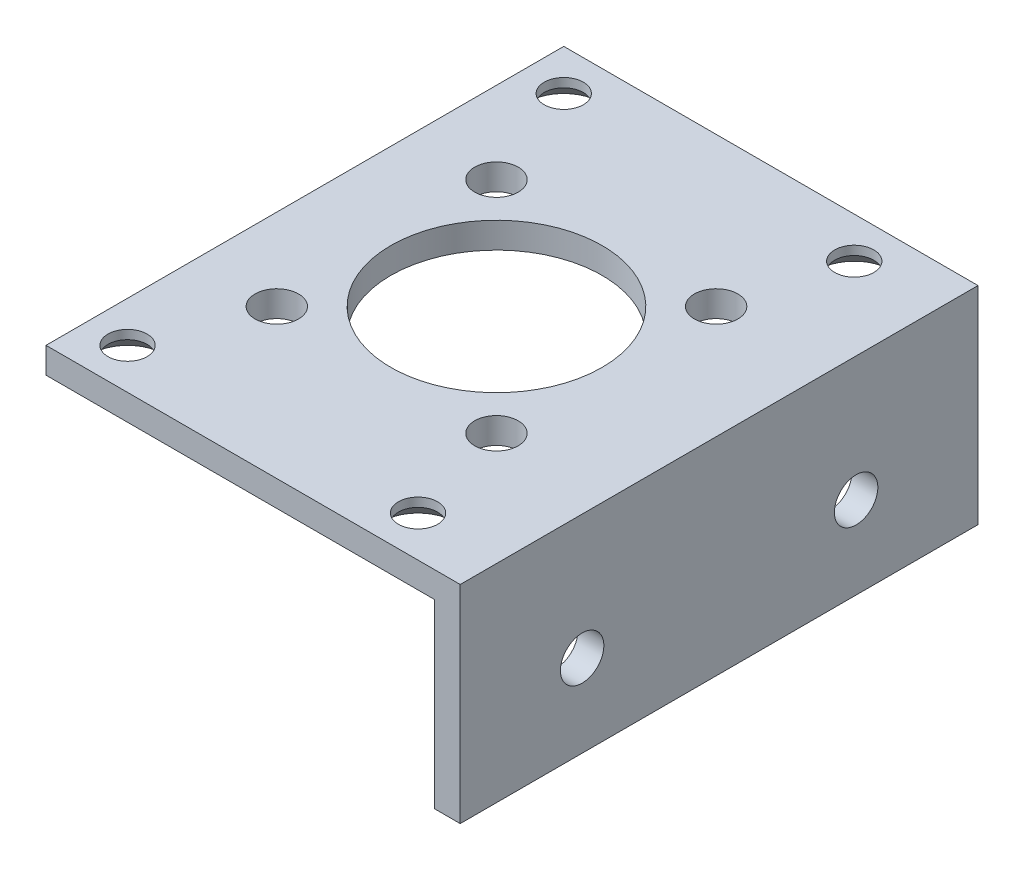
ISO-10303-21;
HEADER;
FILE_DESCRIPTION(('STEP AP214'),'2;1');
FILE_NAME('part.step','',(''),(''),'','','');
FILE_SCHEMA(('AUTOMOTIVE_DESIGN { 1 0 10303 214 1 1 1 1 }'));
ENDSEC;
DATA;
#1=APPLICATION_CONTEXT('core data for automotive mechanical design processes');
#2=APPLICATION_PROTOCOL_DEFINITION('international standard','automotive_design',2000,#1);
#3=PRODUCT_CONTEXT('',#1,'mechanical');
#4=PRODUCT('Part','Part','',(#3));
#5=PRODUCT_RELATED_PRODUCT_CATEGORY('part','',(#4));
#6=PRODUCT_DEFINITION_FORMATION('','',#4);
#7=PRODUCT_DEFINITION_CONTEXT('part definition',#1,'design');
#8=PRODUCT_DEFINITION('design','',#6,#7);
#9=PRODUCT_DEFINITION_SHAPE('','',#8);
#10=(LENGTH_UNIT() NAMED_UNIT(*) SI_UNIT(.MILLI.,.METRE.));
#11=(NAMED_UNIT(*) PLANE_ANGLE_UNIT() SI_UNIT($,.RADIAN.));
#12=(NAMED_UNIT(*) SI_UNIT($,.STERADIAN.) SOLID_ANGLE_UNIT());
#13=UNCERTAINTY_MEASURE_WITH_UNIT(LENGTH_MEASURE(1.E-05),#10,'distance_accuracy_value','');
#14=(GEOMETRIC_REPRESENTATION_CONTEXT(3) GLOBAL_UNCERTAINTY_ASSIGNED_CONTEXT((#13)) GLOBAL_UNIT_ASSIGNED_CONTEXT((#10,
#11,#12)) REPRESENTATION_CONTEXT('',''));
#15=CARTESIAN_POINT('',(0.,0.,0.));
#16=DIRECTION('',(0.,0.,1.));
#17=DIRECTION('',(1.,0.,0.));
#18=AXIS2_PLACEMENT_3D('',#15,#16,#17);
#19=CARTESIAN_POINT('',(-45.8,22.2250000001054,58.5));
#20=DIRECTION('',(0.,-1.,0.));
#21=DIRECTION('',(0.,0.,-1.));
#22=AXIS2_PLACEMENT_3D('',#19,#20,#21);
#23=CONICAL_SURFACE('',#22,4.47999999996319,0.785398163397448);
#24=CARTESIAN_POINT('',(-45.8,24.305,58.5));
#25=DIRECTION('',(0.,-1.,0.));
#26=DIRECTION('',(0.,0.,-1.));
#27=AXIS2_PLACEMENT_3D('',#24,#25,#26);
#28=CIRCLE('',#27,2.39999999999999);
#29=CARTESIAN_POINT('',(-45.8,24.305,56.1));
#30=VERTEX_POINT('',#29);
#31=EDGE_CURVE('E115',#30,#30,#28,.F.);
#32=ORIENTED_EDGE('',*,*,#31,.T.);
#33=EDGE_LOOP('',(#32));
#34=FACE_BOUND('',#33,.T.);
#35=CARTESIAN_POINT('',(-45.8,22.2249999999917,58.5));
#36=DIRECTION('',(0.,-1.,0.));
#37=DIRECTION('',(0.,0.,-1.));
#38=AXIS2_PLACEMENT_3D('',#35,#36,#37);
#39=CIRCLE('',#38,4.48000000007687);
#40=CARTESIAN_POINT('',(-45.8,22.2249999999917,54.0199999999231));
#41=VERTEX_POINT('',#40);
#42=EDGE_CURVE('E118',#41,#41,#39,.T.);
#43=ORIENTED_EDGE('',*,*,#42,.T.);
#44=EDGE_LOOP('',(#43));
#45=FACE_BOUND('',#44,.T.);
#46=ADVANCED_FACE('F17',(#34,#45),#23,.F.);
#47=CARTESIAN_POINT('',(-10.175,22.2249999999917,58.5));
#48=DIRECTION('',(0.,-1.,0.));
#49=DIRECTION('',(0.,0.,-1.));
#50=AXIS2_PLACEMENT_3D('',#47,#48,#49);
#51=CONICAL_SURFACE('',#50,4.48000000002003,0.785398163397448);
#52=CARTESIAN_POINT('',(-10.175,24.305,58.5));
#53=DIRECTION('',(0.,-1.,0.));
#54=DIRECTION('',(0.,0.,-1.));
#55=AXIS2_PLACEMENT_3D('',#52,#53,#54);
#56=CIRCLE('',#55,2.39999999999999);
#57=CARTESIAN_POINT('',(-10.175,24.305,56.1));
#58=VERTEX_POINT('',#57);
#59=EDGE_CURVE('E112',#58,#58,#56,.F.);
#60=ORIENTED_EDGE('',*,*,#59,.T.);
#61=EDGE_LOOP('',(#60));
#62=FACE_BOUND('',#61,.T.);
#63=CARTESIAN_POINT('',(-10.175,22.2249999999917,58.5));
#64=DIRECTION('',(0.,-1.,0.));
#65=DIRECTION('',(0.,0.,-1.));
#66=AXIS2_PLACEMENT_3D('',#63,#64,#65);
#67=CIRCLE('',#66,4.48000000002003);
#68=CARTESIAN_POINT('',(-10.175,22.2249999999917,54.01999999998));
#69=VERTEX_POINT('',#68);
#70=EDGE_CURVE('E103',#69,#69,#67,.T.);
#71=ORIENTED_EDGE('',*,*,#70,.T.);
#72=EDGE_LOOP('',(#71));
#73=FACE_BOUND('',#72,.T.);
#74=ADVANCED_FACE('F261',(#62,#73),#51,.F.);
#75=CARTESIAN_POINT('',(-10.175,22.2250000000486,5.));
#76=DIRECTION('',(0.,-1.,0.));
#77=DIRECTION('',(0.,0.,-1.));
#78=AXIS2_PLACEMENT_3D('',#75,#76,#77);
#79=CONICAL_SURFACE('',#78,4.47999999994863,0.785398163397448);
#80=CARTESIAN_POINT('',(-10.175,24.305,5.));
#81=DIRECTION('',(0.,-1.,0.));
#82=DIRECTION('',(0.,0.,-1.));
#83=AXIS2_PLACEMENT_3D('',#80,#81,#82);
#84=CIRCLE('',#83,2.39999999999999);
#85=CARTESIAN_POINT('',(-10.175,24.305,2.6));
#86=VERTEX_POINT('',#85);
#87=EDGE_CURVE('E109',#86,#86,#84,.F.);
#88=ORIENTED_EDGE('',*,*,#87,.T.);
#89=EDGE_LOOP('',(#88));
#90=FACE_BOUND('',#89,.T.);
#91=CARTESIAN_POINT('',(-10.175,22.2250000000486,5.));
#92=DIRECTION('',(0.,-1.,0.));
#93=DIRECTION('',(0.,0.,-1.));
#94=AXIS2_PLACEMENT_3D('',#91,#92,#93);
#95=CIRCLE('',#94,4.47999999994863);
#96=CARTESIAN_POINT('',(-10.175,22.2250000000486,0.520000000051368));
#97=VERTEX_POINT('',#96);
#98=EDGE_CURVE('E81',#97,#97,#95,.T.);
#99=ORIENTED_EDGE('',*,*,#98,.T.);
#100=EDGE_LOOP('',(#99));
#101=FACE_BOUND('',#100,.T.);
#102=ADVANCED_FACE('F266',(#90,#101),#79,.F.);
#103=CARTESIAN_POINT('',(-45.8,22.2250000001054,5.));
#104=DIRECTION('',(0.,-1.,0.));
#105=DIRECTION('',(0.,0.,-1.));
#106=AXIS2_PLACEMENT_3D('',#103,#104,#105);
#107=CONICAL_SURFACE('',#106,4.47999999994863,0.785398163397448);
#108=CARTESIAN_POINT('',(-45.8,24.305,5.));
#109=DIRECTION('',(0.,-1.,0.));
#110=DIRECTION('',(0.,0.,-1.));
#111=AXIS2_PLACEMENT_3D('',#108,#109,#110);
#112=CIRCLE('',#111,2.39999999999999);
#113=CARTESIAN_POINT('',(-45.8,24.305,2.6));
#114=VERTEX_POINT('',#113);
#115=EDGE_CURVE('E105',#114,#114,#112,.F.);
#116=ORIENTED_EDGE('',*,*,#115,.T.);
#117=EDGE_LOOP('',(#116));
#118=FACE_BOUND('',#117,.T.);
#119=CARTESIAN_POINT('',(-45.8,22.2250000000486,5.));
#120=DIRECTION('',(0.,-1.,0.));
#121=DIRECTION('',(0.,0.,-1.));
#122=AXIS2_PLACEMENT_3D('',#119,#120,#121);
#123=CIRCLE('',#122,4.48000000000547);
#124=CARTESIAN_POINT('',(-45.8,22.2250000000486,0.519999999994525));
#125=VERTEX_POINT('',#124);
#126=EDGE_CURVE('E82',#125,#125,#123,.T.);
#127=ORIENTED_EDGE('',*,*,#126,.T.);
#128=EDGE_LOOP('',(#127));
#129=FACE_BOUND('',#128,.T.);
#130=ADVANCED_FACE('F268',(#118,#129),#107,.F.);
#131=CARTESIAN_POINT('',(0.00100000000000013,10.1104945877069,48.55));
#132=DIRECTION('',(-1.,0.,0.));
#133=DIRECTION('',(0.,0.,1.));
#134=AXIS2_PLACEMENT_3D('',#131,#132,#133);
#135=CYLINDRICAL_SURFACE('',#134,2.665);
#136=CARTESIAN_POINT('',(-3.175,10.1104945877069,48.55));
#137=DIRECTION('',(-1.,0.,0.));
#138=DIRECTION('',(0.,0.,1.));
#139=AXIS2_PLACEMENT_3D('',#136,#137,#138);
#140=CIRCLE('',#139,2.665);
#141=CARTESIAN_POINT('',(-3.175,10.1104945877069,51.215));
#142=VERTEX_POINT('',#141);
#143=EDGE_CURVE('E20',#142,#142,#140,.T.);
#144=ORIENTED_EDGE('',*,*,#143,.T.);
#145=EDGE_LOOP('',(#144));
#146=FACE_BOUND('',#145,.T.);
#147=CARTESIAN_POINT('',(0.,10.1104945877069,48.55));
#148=DIRECTION('',(-1.,0.,0.));
#149=DIRECTION('',(0.,0.,1.));
#150=AXIS2_PLACEMENT_3D('',#147,#148,#149);
#151=CIRCLE('',#150,2.665);
#152=CARTESIAN_POINT('',(0.,10.1104945877069,51.215));
#153=VERTEX_POINT('',#152);
#154=EDGE_CURVE('E150',#153,#153,#151,.F.);
#155=ORIENTED_EDGE('',*,*,#154,.T.);
#156=EDGE_LOOP('',(#155));
#157=FACE_BOUND('',#156,.T.);
#158=ADVANCED_FACE('F180',(#146,#157),#135,.F.);
#159=CARTESIAN_POINT('',(0.00100000000000013,10.1104945877069,14.95));
#160=DIRECTION('',(-1.,0.,0.));
#161=DIRECTION('',(0.,0.,1.));
#162=AXIS2_PLACEMENT_3D('',#159,#160,#161);
#163=CYLINDRICAL_SURFACE('',#162,2.665);
#164=CARTESIAN_POINT('',(-3.175,10.1104945877069,14.95));
#165=DIRECTION('',(-1.,0.,0.));
#166=DIRECTION('',(0.,0.,1.));
#167=AXIS2_PLACEMENT_3D('',#164,#165,#166);
#168=CIRCLE('',#167,2.665);
#169=CARTESIAN_POINT('',(-3.175,10.1104945877069,17.615));
#170=VERTEX_POINT('',#169);
#171=EDGE_CURVE('E104',#170,#170,#168,.T.);
#172=ORIENTED_EDGE('',*,*,#171,.T.);
#173=EDGE_LOOP('',(#172));
#174=FACE_BOUND('',#173,.T.);
#175=CARTESIAN_POINT('',(0.,10.1104945877069,14.95));
#176=DIRECTION('',(-1.,0.,0.));
#177=DIRECTION('',(0.,0.,1.));
#178=AXIS2_PLACEMENT_3D('',#175,#176,#177);
#179=CIRCLE('',#178,2.665);
#180=CARTESIAN_POINT('',(0.,10.1104945877069,17.615));
#181=VERTEX_POINT('',#180);
#182=EDGE_CURVE('E98',#181,#181,#179,.F.);
#183=ORIENTED_EDGE('',*,*,#182,.T.);
#184=EDGE_LOOP('',(#183));
#185=FACE_BOUND('',#184,.T.);
#186=ADVANCED_FACE('F194',(#174,#185),#163,.F.);
#187=CARTESIAN_POINT('',(0.,0.,63.5));
#188=DIRECTION('',(0.,1.,0.));
#189=DIRECTION('',(-1.,0.,0.));
#190=AXIS2_PLACEMENT_3D('',#187,#188,#189);
#191=PLANE('',#190);
#192=DIRECTION('',(0.,0.,1.));
#193=VECTOR('',#192,1.);
#194=CARTESIAN_POINT('',(0.,0.,63.5));
#195=LINE('',#194,#193);
#196=CARTESIAN_POINT('',(0.,0.,0.));
#197=VERTEX_POINT('',#196);
#198=CARTESIAN_POINT('',(0.,0.,63.5));
#199=VERTEX_POINT('',#198);
#200=EDGE_CURVE('E96',#197,#199,#195,.T.);
#201=ORIENTED_EDGE('',*,*,#200,.T.);
#202=DIRECTION('',(-1.,0.,0.));
#203=VECTOR('',#202,1.);
#204=CARTESIAN_POINT('',(0.,0.,63.5));
#205=LINE('',#204,#203);
#206=CARTESIAN_POINT('',(-3.175,0.,63.5));
#207=VERTEX_POINT('',#206);
#208=EDGE_CURVE('E486',#199,#207,#205,.T.);
#209=ORIENTED_EDGE('',*,*,#208,.T.);
#210=DIRECTION('',(0.,0.,-1.));
#211=VECTOR('',#210,1.);
#212=CARTESIAN_POINT('',(-3.175,0.,63.5));
#213=LINE('',#212,#211);
#214=CARTESIAN_POINT('',(-3.175,0.,0.));
#215=VERTEX_POINT('',#214);
#216=EDGE_CURVE('E67',#207,#215,#213,.T.);
#217=ORIENTED_EDGE('',*,*,#216,.T.);
#218=DIRECTION('',(-1.,0.,0.));
#219=VECTOR('',#218,1.);
#220=CARTESIAN_POINT('',(0.,0.,0.));
#221=LINE('',#220,#219);
#222=EDGE_CURVE('E481',#197,#215,#221,.T.);
#223=ORIENTED_EDGE('',*,*,#222,.F.);
#224=EDGE_LOOP('',(#201,#209,#217,#223));
#225=FACE_BOUND('',#224,.T.);
#226=ADVANCED_FACE('F184',(#225),#191,.F.);
#227=CARTESIAN_POINT('',(-3.175,0.,63.5));
#228=DIRECTION('',(1.,0.,0.));
#229=DIRECTION('',(0.,0.,-1.));
#230=AXIS2_PLACEMENT_3D('',#227,#228,#229);
#231=PLANE('',#230);
#232=ORIENTED_EDGE('',*,*,#216,.F.);
#233=DIRECTION('',(0.,1.,0.));
#234=VECTOR('',#233,1.);
#235=CARTESIAN_POINT('',(-3.175,0.,63.5));
#236=LINE('',#235,#234);
#237=CARTESIAN_POINT('',(-3.175,22.225,63.5));
#238=VERTEX_POINT('',#237);
#239=EDGE_CURVE('E88',#207,#238,#236,.T.);
#240=ORIENTED_EDGE('',*,*,#239,.T.);
#241=DIRECTION('',(0.,0.,1.));
#242=VECTOR('',#241,1.);
#243=CARTESIAN_POINT('',(-3.175,22.225,63.5));
#244=LINE('',#243,#242);
#245=CARTESIAN_POINT('',(-3.175,22.225,0.));
#246=VERTEX_POINT('',#245);
#247=EDGE_CURVE('E73',#238,#246,#244,.F.);
#248=ORIENTED_EDGE('',*,*,#247,.T.);
#249=DIRECTION('',(0.,1.,0.));
#250=VECTOR('',#249,1.);
#251=CARTESIAN_POINT('',(-3.175,0.,0.));
#252=LINE('',#251,#250);
#253=EDGE_CURVE('E479',#215,#246,#252,.T.);
#254=ORIENTED_EDGE('',*,*,#253,.F.);
#255=EDGE_LOOP('',(#232,#240,#248,#254));
#256=FACE_BOUND('',#255,.T.);
#257=ORIENTED_EDGE('',*,*,#171,.F.);
#258=EDGE_LOOP('',(#257));
#259=FACE_BOUND('',#258,.T.);
#260=ORIENTED_EDGE('',*,*,#143,.F.);
#261=EDGE_LOOP('',(#260));
#262=FACE_BOUND('',#261,.T.);
#263=ADVANCED_FACE('F94',(#256,#259,#262),#231,.F.);
#264=CARTESIAN_POINT('',(-3.175,22.225,63.5));
#265=DIRECTION('',(0.,1.,0.));
#266=DIRECTION('',(-1.,0.,0.));
#267=AXIS2_PLACEMENT_3D('',#264,#265,#266);
#268=PLANE('',#267);
#269=ORIENTED_EDGE('',*,*,#42,.F.);
#270=EDGE_LOOP('',(#269));
#271=FACE_BOUND('',#270,.T.);
#272=ORIENTED_EDGE('',*,*,#98,.F.);
#273=EDGE_LOOP('',(#272));
#274=FACE_BOUND('',#273,.T.);
#275=ORIENTED_EDGE('',*,*,#247,.F.);
#276=DIRECTION('',(-1.,0.,0.));
#277=VECTOR('',#276,1.);
#278=CARTESIAN_POINT('',(0.,22.225,63.5));
#279=LINE('',#278,#277);
#280=CARTESIAN_POINT('',(-50.8,22.225,63.5));
#281=VERTEX_POINT('',#280);
#282=EDGE_CURVE('E78',#238,#281,#279,.T.);
#283=ORIENTED_EDGE('',*,*,#282,.T.);
#284=DIRECTION('',(0.,0.,-1.));
#285=VECTOR('',#284,1.);
#286=CARTESIAN_POINT('',(-50.8,22.225,63.5));
#287=LINE('',#286,#285);
#288=CARTESIAN_POINT('',(-50.8,22.225,0.));
#289=VERTEX_POINT('',#288);
#290=EDGE_CURVE('E483',#281,#289,#287,.T.);
#291=ORIENTED_EDGE('',*,*,#290,.T.);
#292=DIRECTION('',(-1.,0.,0.));
#293=VECTOR('',#292,1.);
#294=CARTESIAN_POINT('',(0.,22.225,0.));
#295=LINE('',#294,#293);
#296=EDGE_CURVE('E80',#246,#289,#295,.T.);
#297=ORIENTED_EDGE('',*,*,#296,.F.);
#298=EDGE_LOOP('',(#275,#283,#291,#297));
#299=FACE_BOUND('',#298,.T.);
#300=CARTESIAN_POINT('',(-27.305,22.225,31.75));
#301=DIRECTION('',(0.,-1.,0.));
#302=DIRECTION('',(1.,0.,0.));
#303=AXIS2_PLACEMENT_3D('',#300,#301,#302);
#304=CIRCLE('',#303,12.954);
#305=CARTESIAN_POINT('',(-14.351,22.225,31.75));
#306=VERTEX_POINT('',#305);
#307=EDGE_CURVE('E153',#306,#306,#304,.F.);
#308=ORIENTED_EDGE('',*,*,#307,.T.);
#309=EDGE_LOOP('',(#308));
#310=FACE_BOUND('',#309,.T.);
#311=CARTESIAN_POINT('',(-13.8346158183963,22.225,45.2203841816037));
#312=DIRECTION('',(0.,1.,0.));
#313=DIRECTION('',(-1.,0.,0.));
#314=AXIS2_PLACEMENT_3D('',#311,#312,#313);
#315=CIRCLE('',#314,2.66499999999997);
#316=CARTESIAN_POINT('',(-16.4996158183962,22.225,45.2203841816037));
#317=VERTEX_POINT('',#316);
#318=EDGE_CURVE('E156',#317,#317,#315,.T.);
#319=ORIENTED_EDGE('',*,*,#318,.T.);
#320=EDGE_LOOP('',(#319));
#321=FACE_BOUND('',#320,.T.);
#322=CARTESIAN_POINT('',(-13.8346158183963,22.225,18.2796158183963));
#323=DIRECTION('',(0.,1.,0.));
#324=DIRECTION('',(-1.,0.,0.));
#325=AXIS2_PLACEMENT_3D('',#322,#323,#324);
#326=CIRCLE('',#325,2.665);
#327=CARTESIAN_POINT('',(-16.4996158183963,22.225,18.2796158183963));
#328=VERTEX_POINT('',#327);
#329=EDGE_CURVE('E159',#328,#328,#326,.T.);
#330=ORIENTED_EDGE('',*,*,#329,.T.);
#331=EDGE_LOOP('',(#330));
#332=FACE_BOUND('',#331,.T.);
#333=CARTESIAN_POINT('',(-40.7753841816037,22.225,18.2796158183963));
#334=DIRECTION('',(0.,1.,0.));
#335=DIRECTION('',(-1.,0.,0.));
#336=AXIS2_PLACEMENT_3D('',#333,#334,#335);
#337=CIRCLE('',#336,2.665);
#338=CARTESIAN_POINT('',(-43.4403841816037,22.225,18.2796158183963));
#339=VERTEX_POINT('',#338);
#340=EDGE_CURVE('E162',#339,#339,#337,.T.);
#341=ORIENTED_EDGE('',*,*,#340,.T.);
#342=EDGE_LOOP('',(#341));
#343=FACE_BOUND('',#342,.T.);
#344=CARTESIAN_POINT('',(-40.7753841816037,22.225,45.2203841816037));
#345=DIRECTION('',(0.,1.,0.));
#346=DIRECTION('',(-1.,0.,0.));
#347=AXIS2_PLACEMENT_3D('',#344,#345,#346);
#348=CIRCLE('',#347,2.665);
#349=CARTESIAN_POINT('',(-43.4403841816037,22.225,45.2203841816037));
#350=VERTEX_POINT('',#349);
#351=EDGE_CURVE('E108',#350,#350,#348,.T.);
#352=ORIENTED_EDGE('',*,*,#351,.T.);
#353=EDGE_LOOP('',(#352));
#354=FACE_BOUND('',#353,.T.);
#355=ORIENTED_EDGE('',*,*,#126,.F.);
#356=EDGE_LOOP('',(#355));
#357=FACE_BOUND('',#356,.T.);
#358=ORIENTED_EDGE('',*,*,#70,.F.);
#359=EDGE_LOOP('',(#358));
#360=FACE_BOUND('',#359,.T.);
#361=ADVANCED_FACE('F75',(#271,#274,#299,#310,#321,#332,#343,#354,#357,#360),#268,.F.);
#362=CARTESIAN_POINT('',(-45.8,22.225,58.5));
#363=DIRECTION('',(0.,-1.,0.));
#364=DIRECTION('',(0.,0.,-1.));
#365=AXIS2_PLACEMENT_3D('',#362,#363,#364);
#366=CYLINDRICAL_SURFACE('',#365,2.39999999999999);
#367=CARTESIAN_POINT('',(-45.8,25.4,58.5));
#368=DIRECTION('',(0.,-1.,0.));
#369=DIRECTION('',(0.,0.,-1.));
#370=AXIS2_PLACEMENT_3D('',#367,#368,#369);
#371=CIRCLE('',#370,2.39999999999999);
#372=CARTESIAN_POINT('',(-45.8,25.4,56.1));
#373=VERTEX_POINT('',#372);
#374=EDGE_CURVE('E144',#373,#373,#371,.F.);
#375=ORIENTED_EDGE('',*,*,#374,.T.);
#376=EDGE_LOOP('',(#375));
#377=FACE_BOUND('',#376,.T.);
#378=ORIENTED_EDGE('',*,*,#31,.F.);
#379=EDGE_LOOP('',(#378));
#380=FACE_BOUND('',#379,.T.);
#381=ADVANCED_FACE('F191',(#377,#380),#366,.F.);
#382=CARTESIAN_POINT('',(-10.175,22.225,58.5));
#383=DIRECTION('',(0.,-1.,0.));
#384=DIRECTION('',(0.,0.,-1.));
#385=AXIS2_PLACEMENT_3D('',#382,#383,#384);
#386=CYLINDRICAL_SURFACE('',#385,2.39999999999999);
#387=CARTESIAN_POINT('',(-10.175,25.4,58.5));
#388=DIRECTION('',(0.,-1.,0.));
#389=DIRECTION('',(0.,0.,-1.));
#390=AXIS2_PLACEMENT_3D('',#387,#388,#389);
#391=CIRCLE('',#390,2.39999999999999);
#392=CARTESIAN_POINT('',(-10.175,25.4,56.1));
#393=VERTEX_POINT('',#392);
#394=EDGE_CURVE('E141',#393,#393,#391,.F.);
#395=ORIENTED_EDGE('',*,*,#394,.T.);
#396=EDGE_LOOP('',(#395));
#397=FACE_BOUND('',#396,.T.);
#398=ORIENTED_EDGE('',*,*,#59,.F.);
#399=EDGE_LOOP('',(#398));
#400=FACE_BOUND('',#399,.T.);
#401=ADVANCED_FACE('F246',(#397,#400),#386,.F.);
#402=CARTESIAN_POINT('',(-10.175,22.225,5.));
#403=DIRECTION('',(0.,-1.,0.));
#404=DIRECTION('',(0.,0.,-1.));
#405=AXIS2_PLACEMENT_3D('',#402,#403,#404);
#406=CYLINDRICAL_SURFACE('',#405,2.39999999999999);
#407=CARTESIAN_POINT('',(-10.175,25.4,5.));
#408=DIRECTION('',(0.,-1.,0.));
#409=DIRECTION('',(0.,0.,-1.));
#410=AXIS2_PLACEMENT_3D('',#407,#408,#409);
#411=CIRCLE('',#410,2.39999999999999);
#412=CARTESIAN_POINT('',(-10.175,25.4,2.6));
#413=VERTEX_POINT('',#412);
#414=EDGE_CURVE('E138',#413,#413,#411,.F.);
#415=ORIENTED_EDGE('',*,*,#414,.T.);
#416=EDGE_LOOP('',(#415));
#417=FACE_BOUND('',#416,.T.);
#418=ORIENTED_EDGE('',*,*,#87,.F.);
#419=EDGE_LOOP('',(#418));
#420=FACE_BOUND('',#419,.T.);
#421=ADVANCED_FACE('F242',(#417,#420),#406,.F.);
#422=CARTESIAN_POINT('',(-45.8,22.225,5.));
#423=DIRECTION('',(0.,-1.,0.));
#424=DIRECTION('',(0.,0.,-1.));
#425=AXIS2_PLACEMENT_3D('',#422,#423,#424);
#426=CYLINDRICAL_SURFACE('',#425,2.39999999999999);
#427=CARTESIAN_POINT('',(-45.8,25.4,5.));
#428=DIRECTION('',(0.,-1.,0.));
#429=DIRECTION('',(0.,0.,-1.));
#430=AXIS2_PLACEMENT_3D('',#427,#428,#429);
#431=CIRCLE('',#430,2.39999999999999);
#432=CARTESIAN_POINT('',(-45.8,25.4,2.6));
#433=VERTEX_POINT('',#432);
#434=EDGE_CURVE('E135',#433,#433,#431,.F.);
#435=ORIENTED_EDGE('',*,*,#434,.T.);
#436=EDGE_LOOP('',(#435));
#437=FACE_BOUND('',#436,.T.);
#438=ORIENTED_EDGE('',*,*,#115,.F.);
#439=EDGE_LOOP('',(#438));
#440=FACE_BOUND('',#439,.T.);
#441=ADVANCED_FACE('F238',(#437,#440),#426,.F.);
#442=CARTESIAN_POINT('',(-40.7753841816037,-0.00100000000000794,45.2203841816037));
#443=DIRECTION('',(0.,1.,0.));
#444=DIRECTION('',(-1.,0.,0.));
#445=AXIS2_PLACEMENT_3D('',#442,#443,#444);
#446=CYLINDRICAL_SURFACE('',#445,2.665);
#447=ORIENTED_EDGE('',*,*,#351,.F.);
#448=EDGE_LOOP('',(#447));
#449=FACE_BOUND('',#448,.T.);
#450=CARTESIAN_POINT('',(-40.7753841816037,25.4,45.2203841816037));
#451=DIRECTION('',(0.,1.,0.));
#452=DIRECTION('',(-1.,0.,0.));
#453=AXIS2_PLACEMENT_3D('',#450,#451,#452);
#454=CIRCLE('',#453,2.665);
#455=CARTESIAN_POINT('',(-43.4403841816037,25.4,45.2203841816037));
#456=VERTEX_POINT('',#455);
#457=EDGE_CURVE('E132',#456,#456,#454,.T.);
#458=ORIENTED_EDGE('',*,*,#457,.T.);
#459=EDGE_LOOP('',(#458));
#460=FACE_BOUND('',#459,.T.);
#461=ADVANCED_FACE('F234',(#449,#460),#446,.F.);
#462=CARTESIAN_POINT('',(-40.7753841816037,-0.00100000000000794,18.2796158183963));
#463=DIRECTION('',(0.,1.,0.));
#464=DIRECTION('',(-1.,0.,0.));
#465=AXIS2_PLACEMENT_3D('',#462,#463,#464);
#466=CYLINDRICAL_SURFACE('',#465,2.665);
#467=ORIENTED_EDGE('',*,*,#340,.F.);
#468=EDGE_LOOP('',(#467));
#469=FACE_BOUND('',#468,.T.);
#470=CARTESIAN_POINT('',(-40.7753841816037,25.4,18.2796158183963));
#471=DIRECTION('',(0.,1.,0.));
#472=DIRECTION('',(-1.,0.,0.));
#473=AXIS2_PLACEMENT_3D('',#470,#471,#472);
#474=CIRCLE('',#473,2.665);
#475=CARTESIAN_POINT('',(-43.4403841816037,25.4,18.2796158183963));
#476=VERTEX_POINT('',#475);
#477=EDGE_CURVE('E129',#476,#476,#474,.T.);
#478=ORIENTED_EDGE('',*,*,#477,.T.);
#479=EDGE_LOOP('',(#478));
#480=FACE_BOUND('',#479,.T.);
#481=ADVANCED_FACE('F230',(#469,#480),#466,.F.);
#482=CARTESIAN_POINT('',(-13.8346158183963,-0.00100000000000447,18.2796158183963));
#483=DIRECTION('',(0.,1.,0.));
#484=DIRECTION('',(-1.,0.,0.));
#485=AXIS2_PLACEMENT_3D('',#482,#483,#484);
#486=CYLINDRICAL_SURFACE('',#485,2.665);
#487=ORIENTED_EDGE('',*,*,#329,.F.);
#488=EDGE_LOOP('',(#487));
#489=FACE_BOUND('',#488,.T.);
#490=CARTESIAN_POINT('',(-13.8346158183963,25.4,18.2796158183963));
#491=DIRECTION('',(0.,1.,0.));
#492=DIRECTION('',(-1.,0.,0.));
#493=AXIS2_PLACEMENT_3D('',#490,#491,#492);
#494=CIRCLE('',#493,2.665);
#495=CARTESIAN_POINT('',(-16.4996158183963,25.4,18.2796158183963));
#496=VERTEX_POINT('',#495);
#497=EDGE_CURVE('E126',#496,#496,#494,.T.);
#498=ORIENTED_EDGE('',*,*,#497,.T.);
#499=EDGE_LOOP('',(#498));
#500=FACE_BOUND('',#499,.T.);
#501=ADVANCED_FACE('F226',(#489,#500),#486,.F.);
#502=CARTESIAN_POINT('',(-13.8346158183963,-0.00100000000000447,45.2203841816037));
#503=DIRECTION('',(0.,1.,0.));
#504=DIRECTION('',(-1.,0.,0.));
#505=AXIS2_PLACEMENT_3D('',#502,#503,#504);
#506=CYLINDRICAL_SURFACE('',#505,2.66499999999997);
#507=ORIENTED_EDGE('',*,*,#318,.F.);
#508=EDGE_LOOP('',(#507));
#509=FACE_BOUND('',#508,.T.);
#510=CARTESIAN_POINT('',(-13.8346158183963,25.4,45.2203841816037));
#511=DIRECTION('',(0.,1.,0.));
#512=DIRECTION('',(-1.,0.,0.));
#513=AXIS2_PLACEMENT_3D('',#510,#511,#512);
#514=CIRCLE('',#513,2.66499999999997);
#515=CARTESIAN_POINT('',(-16.4996158183962,25.4,45.2203841816037));
#516=VERTEX_POINT('',#515);
#517=EDGE_CURVE('E123',#516,#516,#514,.T.);
#518=ORIENTED_EDGE('',*,*,#517,.T.);
#519=EDGE_LOOP('',(#518));
#520=FACE_BOUND('',#519,.T.);
#521=ADVANCED_FACE('F222',(#509,#520),#506,.F.);
#522=CARTESIAN_POINT('',(-27.305,25.401,31.75));
#523=DIRECTION('',(0.,-1.,0.));
#524=DIRECTION('',(1.,0.,0.));
#525=AXIS2_PLACEMENT_3D('',#522,#523,#524);
#526=CYLINDRICAL_SURFACE('',#525,12.954);
#527=ORIENTED_EDGE('',*,*,#307,.F.);
#528=EDGE_LOOP('',(#527));
#529=FACE_BOUND('',#528,.T.);
#530=CARTESIAN_POINT('',(-27.305,25.4,31.75));
#531=DIRECTION('',(0.,-1.,0.));
#532=DIRECTION('',(1.,0.,0.));
#533=AXIS2_PLACEMENT_3D('',#530,#531,#532);
#534=CIRCLE('',#533,12.954);
#535=CARTESIAN_POINT('',(-14.351,25.4,31.75));
#536=VERTEX_POINT('',#535);
#537=EDGE_CURVE('E119',#536,#536,#534,.F.);
#538=ORIENTED_EDGE('',*,*,#537,.T.);
#539=EDGE_LOOP('',(#538));
#540=FACE_BOUND('',#539,.T.);
#541=ADVANCED_FACE('F218',(#529,#540),#526,.F.);
#542=CARTESIAN_POINT('',(0.,0.,63.5));
#543=DIRECTION('',(-1.,0.,0.));
#544=DIRECTION('',(0.,0.,1.));
#545=AXIS2_PLACEMENT_3D('',#542,#543,#544);
#546=PLANE('',#545);
#547=DIRECTION('',(0.,0.,1.));
#548=VECTOR('',#547,1.);
#549=CARTESIAN_POINT('',(0.,25.4,63.5));
#550=LINE('',#549,#548);
#551=CARTESIAN_POINT('',(0.,25.4,0.));
#552=VERTEX_POINT('',#551);
#553=CARTESIAN_POINT('',(0.,25.4,63.5));
#554=VERTEX_POINT('',#553);
#555=EDGE_CURVE('E122',#552,#554,#550,.T.);
#556=ORIENTED_EDGE('',*,*,#555,.T.);
#557=DIRECTION('',(0.,1.,0.));
#558=VECTOR('',#557,1.);
#559=CARTESIAN_POINT('',(0.,0.,63.5));
#560=LINE('',#559,#558);
#561=EDGE_CURVE('E92',#554,#199,#560,.F.);
#562=ORIENTED_EDGE('',*,*,#561,.T.);
#563=ORIENTED_EDGE('',*,*,#200,.F.);
#564=DIRECTION('',(0.,1.,0.));
#565=VECTOR('',#564,1.);
#566=CARTESIAN_POINT('',(0.,0.,0.));
#567=LINE('',#566,#565);
#568=EDGE_CURVE('E147',#552,#197,#567,.F.);
#569=ORIENTED_EDGE('',*,*,#568,.F.);
#570=EDGE_LOOP('',(#556,#562,#563,#569));
#571=FACE_BOUND('',#570,.T.);
#572=ORIENTED_EDGE('',*,*,#182,.F.);
#573=EDGE_LOOP('',(#572));
#574=FACE_BOUND('',#573,.T.);
#575=ORIENTED_EDGE('',*,*,#154,.F.);
#576=EDGE_LOOP('',(#575));
#577=FACE_BOUND('',#576,.T.);
#578=ADVANCED_FACE('F215',(#571,#574,#577),#546,.F.);
#579=CARTESIAN_POINT('',(0.,0.,63.5));
#580=DIRECTION('',(0.,0.,-1.));
#581=DIRECTION('',(-1.,0.,0.));
#582=AXIS2_PLACEMENT_3D('',#579,#580,#581);
#583=PLANE('',#582);
#584=ORIENTED_EDGE('',*,*,#561,.F.);
#585=DIRECTION('',(1.,0.,0.));
#586=VECTOR('',#585,1.);
#587=CARTESIAN_POINT('',(0.,25.4,63.5));
#588=LINE('',#587,#586);
#589=CARTESIAN_POINT('',(-50.8,25.4,63.5));
#590=VERTEX_POINT('',#589);
#591=EDGE_CURVE('E471',#554,#590,#588,.F.);
#592=ORIENTED_EDGE('',*,*,#591,.T.);
#593=DIRECTION('',(0.,1.,0.));
#594=VECTOR('',#593,1.);
#595=CARTESIAN_POINT('',(-50.8,25.4,63.5));
#596=LINE('',#595,#594);
#597=EDGE_CURVE('E91',#590,#281,#596,.F.);
#598=ORIENTED_EDGE('',*,*,#597,.T.);
#599=ORIENTED_EDGE('',*,*,#282,.F.);
#600=ORIENTED_EDGE('',*,*,#239,.F.);
#601=ORIENTED_EDGE('',*,*,#208,.F.);
#602=EDGE_LOOP('',(#584,#592,#598,#599,#600,#601));
#603=FACE_BOUND('',#602,.T.);
#604=ADVANCED_FACE('F86',(#603),#583,.F.);
#605=CARTESIAN_POINT('',(-50.8,25.4,63.5));
#606=DIRECTION('',(1.,0.,0.));
#607=DIRECTION('',(0.,0.,-1.));
#608=AXIS2_PLACEMENT_3D('',#605,#606,#607);
#609=PLANE('',#608);
#610=ORIENTED_EDGE('',*,*,#290,.F.);
#611=ORIENTED_EDGE('',*,*,#597,.F.);
#612=DIRECTION('',(0.,0.,1.));
#613=VECTOR('',#612,1.);
#614=CARTESIAN_POINT('',(-50.8,25.4,63.5));
#615=LINE('',#614,#613);
#616=CARTESIAN_POINT('',(-50.8,25.4,0.));
#617=VERTEX_POINT('',#616);
#618=EDGE_CURVE('E26',#590,#617,#615,.F.);
#619=ORIENTED_EDGE('',*,*,#618,.T.);
#620=DIRECTION('',(0.,1.,0.));
#621=VECTOR('',#620,1.);
#622=CARTESIAN_POINT('',(-50.8,0.,0.));
#623=LINE('',#622,#621);
#624=EDGE_CURVE('E34',#289,#617,#623,.T.);
#625=ORIENTED_EDGE('',*,*,#624,.F.);
#626=EDGE_LOOP('',(#610,#611,#619,#625));
#627=FACE_BOUND('',#626,.T.);
#628=ADVANCED_FACE('F205',(#627),#609,.F.);
#629=CARTESIAN_POINT('',(0.,0.,0.));
#630=DIRECTION('',(0.,0.,-1.));
#631=DIRECTION('',(-1.,0.,0.));
#632=AXIS2_PLACEMENT_3D('',#629,#630,#631);
#633=PLANE('',#632);
#634=DIRECTION('',(1.,0.,0.));
#635=VECTOR('',#634,1.);
#636=CARTESIAN_POINT('',(0.,25.4,0.));
#637=LINE('',#636,#635);
#638=EDGE_CURVE('E11',#617,#552,#637,.T.);
#639=ORIENTED_EDGE('',*,*,#638,.T.);
#640=ORIENTED_EDGE('',*,*,#568,.T.);
#641=ORIENTED_EDGE('',*,*,#222,.T.);
#642=ORIENTED_EDGE('',*,*,#253,.T.);
#643=ORIENTED_EDGE('',*,*,#296,.T.);
#644=ORIENTED_EDGE('',*,*,#624,.T.);
#645=EDGE_LOOP('',(#639,#640,#641,#642,#643,#644));
#646=FACE_BOUND('',#645,.T.);
#647=ADVANCED_FACE('F199',(#646),#633,.T.);
#648=CARTESIAN_POINT('',(0.,25.4,63.5));
#649=DIRECTION('',(0.,-1.,0.));
#650=DIRECTION('',(1.,0.,0.));
#651=AXIS2_PLACEMENT_3D('',#648,#649,#650);
#652=PLANE('',#651);
#653=ORIENTED_EDGE('',*,*,#618,.F.);
#654=ORIENTED_EDGE('',*,*,#591,.F.);
#655=ORIENTED_EDGE('',*,*,#555,.F.);
#656=ORIENTED_EDGE('',*,*,#638,.F.);
#657=EDGE_LOOP('',(#653,#654,#655,#656));
#658=FACE_BOUND('',#657,.T.);
#659=ORIENTED_EDGE('',*,*,#537,.F.);
#660=EDGE_LOOP('',(#659));
#661=FACE_BOUND('',#660,.T.);
#662=ORIENTED_EDGE('',*,*,#517,.F.);
#663=EDGE_LOOP('',(#662));
#664=FACE_BOUND('',#663,.T.);
#665=ORIENTED_EDGE('',*,*,#497,.F.);
#666=EDGE_LOOP('',(#665));
#667=FACE_BOUND('',#666,.T.);
#668=ORIENTED_EDGE('',*,*,#477,.F.);
#669=EDGE_LOOP('',(#668));
#670=FACE_BOUND('',#669,.T.);
#671=ORIENTED_EDGE('',*,*,#457,.F.);
#672=EDGE_LOOP('',(#671));
#673=FACE_BOUND('',#672,.T.);
#674=ORIENTED_EDGE('',*,*,#434,.F.);
#675=EDGE_LOOP('',(#674));
#676=FACE_BOUND('',#675,.T.);
#677=ORIENTED_EDGE('',*,*,#414,.F.);
#678=EDGE_LOOP('',(#677));
#679=FACE_BOUND('',#678,.T.);
#680=ORIENTED_EDGE('',*,*,#394,.F.);
#681=EDGE_LOOP('',(#680));
#682=FACE_BOUND('',#681,.T.);
#683=ORIENTED_EDGE('',*,*,#374,.F.);
#684=EDGE_LOOP('',(#683));
#685=FACE_BOUND('',#684,.T.);
#686=ADVANCED_FACE('F197',(#658,#661,#664,#667,#670,#673,#676,#679,#682,#685),#652,.F.);
#687=CLOSED_SHELL('',(#46,#74,#102,#130,#158,#186,#226,#263,#361,#381,#401,#421,#441,#461,#481,
#501,#521,#541,#578,#604,#628,#647,#686));
#688=MANIFOLD_SOLID_BREP('B1',#687);
#689=ADVANCED_BREP_SHAPE_REPRESENTATION('',(#18,#688),#14);
#690=SHAPE_DEFINITION_REPRESENTATION(#9,#689);
ENDSEC;
END-ISO-10303-21;
